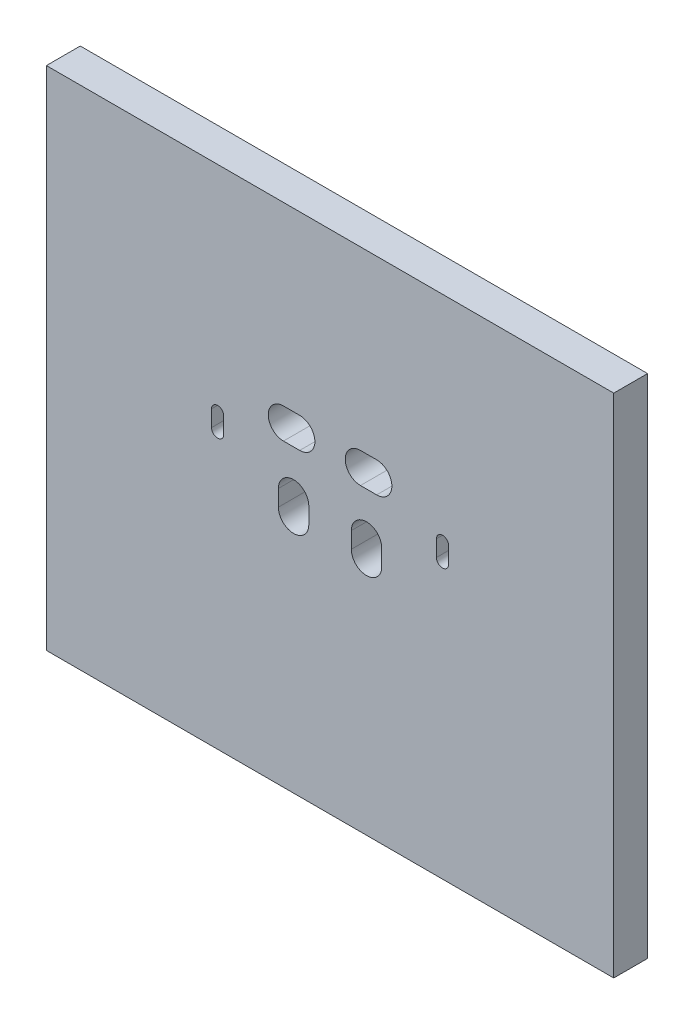
ISO-10303-21;
HEADER;
FILE_DESCRIPTION(('STEP AP214'),'2;1');
FILE_NAME('part.step','',(''),(''),'','','');
FILE_SCHEMA(('AUTOMOTIVE_DESIGN { 1 0 10303 214 1 1 1 1 }'));
ENDSEC;
DATA;
#1=APPLICATION_CONTEXT('core data for automotive mechanical design processes');
#2=APPLICATION_PROTOCOL_DEFINITION('international standard','automotive_design',2000,#1);
#3=PRODUCT_CONTEXT('',#1,'mechanical');
#4=PRODUCT('Part','Part','',(#3));
#5=PRODUCT_RELATED_PRODUCT_CATEGORY('part','',(#4));
#6=PRODUCT_DEFINITION_FORMATION('','',#4);
#7=PRODUCT_DEFINITION_CONTEXT('part definition',#1,'design');
#8=PRODUCT_DEFINITION('design','',#6,#7);
#9=PRODUCT_DEFINITION_SHAPE('','',#8);
#10=(LENGTH_UNIT() NAMED_UNIT(*) SI_UNIT(.MILLI.,.METRE.));
#11=(NAMED_UNIT(*) PLANE_ANGLE_UNIT() SI_UNIT($,.RADIAN.));
#12=(NAMED_UNIT(*) SI_UNIT($,.STERADIAN.) SOLID_ANGLE_UNIT());
#13=UNCERTAINTY_MEASURE_WITH_UNIT(LENGTH_MEASURE(1.E-05),#10,'distance_accuracy_value','');
#14=(GEOMETRIC_REPRESENTATION_CONTEXT(3) GLOBAL_UNCERTAINTY_ASSIGNED_CONTEXT((#13)) GLOBAL_UNIT_ASSIGNED_CONTEXT((#10,
#11,#12)) REPRESENTATION_CONTEXT('',''));
#15=CARTESIAN_POINT('',(0.,0.,0.));
#16=DIRECTION('',(0.,0.,1.));
#17=DIRECTION('',(1.,0.,0.));
#18=AXIS2_PLACEMENT_3D('',#15,#16,#17);
#19=CARTESIAN_POINT('',(8.45000088,14.39999914,0.));
#20=DIRECTION('',(0.,0.,-1.));
#21=DIRECTION('',(-1.,0.,0.));
#22=AXIS2_PLACEMENT_3D('',#19,#20,#21);
#23=CYLINDRICAL_SURFACE('',#22,0.2999994);
#24=CARTESIAN_POINT('',(8.45000088,14.39999914,1.67111934));
#25=DIRECTION('',(0.,0.,-1.));
#26=DIRECTION('',(-1.,0.,0.));
#27=AXIS2_PLACEMENT_3D('',#24,#25,#26);
#28=CIRCLE('',#27,0.2999994);
#29=CARTESIAN_POINT('',(8.15000148,14.39999914,1.67111934));
#30=VERTEX_POINT('',#29);
#31=CARTESIAN_POINT('',(8.75000028,14.39999914,1.67111934));
#32=VERTEX_POINT('',#31);
#33=EDGE_CURVE('E190',#30,#32,#28,.T.);
#34=ORIENTED_EDGE('',*,*,#33,.F.);
#35=DIRECTION('',(0.,0.,-1.));
#36=VECTOR('',#35,1.);
#37=CARTESIAN_POINT('',(8.15000148,14.39999914,0.));
#38=LINE('',#37,#36);
#39=CARTESIAN_POINT('',(8.15000148,14.39999914,0.));
#40=VERTEX_POINT('',#39);
#41=EDGE_CURVE('E192',#40,#30,#38,.F.);
#42=ORIENTED_EDGE('',*,*,#41,.F.);
#43=CARTESIAN_POINT('',(8.45000088,14.39999914,0.));
#44=DIRECTION('',(0.,0.,-1.));
#45=DIRECTION('',(-1.,0.,0.));
#46=AXIS2_PLACEMENT_3D('',#43,#44,#45);
#47=CIRCLE('',#46,0.2999994);
#48=CARTESIAN_POINT('',(8.75000028,14.39999914,0.));
#49=VERTEX_POINT('',#48);
#50=EDGE_CURVE('E19',#49,#40,#47,.F.);
#51=ORIENTED_EDGE('',*,*,#50,.F.);
#52=DIRECTION('',(0.,0.,1.));
#53=VECTOR('',#52,1.);
#54=CARTESIAN_POINT('',(8.75000028,14.39999914,0.));
#55=LINE('',#54,#53);
#56=EDGE_CURVE('E207',#32,#49,#55,.F.);
#57=ORIENTED_EDGE('',*,*,#56,.F.);
#58=EDGE_LOOP('',(#34,#42,#51,#57));
#59=FACE_BOUND('',#58,.T.);
#60=ADVANCED_FACE('F16',(#59),#23,.F.);
#61=CARTESIAN_POINT('',(19.549999,14.39999914,0.));
#62=DIRECTION('',(0.,0.,-1.));
#63=DIRECTION('',(-1.,0.,0.));
#64=AXIS2_PLACEMENT_3D('',#61,#62,#63);
#65=CYLINDRICAL_SURFACE('',#64,0.2999994);
#66=CARTESIAN_POINT('',(19.549999,14.39999914,1.67111934));
#67=DIRECTION('',(0.,0.,-1.));
#68=DIRECTION('',(-1.,0.,0.));
#69=AXIS2_PLACEMENT_3D('',#66,#67,#68);
#70=CIRCLE('',#69,0.2999994);
#71=CARTESIAN_POINT('',(19.8499984,14.39999914,1.67111934));
#72=VERTEX_POINT('',#71);
#73=CARTESIAN_POINT('',(19.2499996,14.39999914,1.67111934));
#74=VERTEX_POINT('',#73);
#75=EDGE_CURVE('E217',#72,#74,#70,.F.);
#76=ORIENTED_EDGE('',*,*,#75,.T.);
#77=DIRECTION('',(0.,0.,-1.));
#78=VECTOR('',#77,1.);
#79=CARTESIAN_POINT('',(19.2499996,14.39999914,0.));
#80=LINE('',#79,#78);
#81=CARTESIAN_POINT('',(19.2499996,14.39999914,0.));
#82=VERTEX_POINT('',#81);
#83=EDGE_CURVE('E213',#82,#74,#80,.F.);
#84=ORIENTED_EDGE('',*,*,#83,.F.);
#85=CARTESIAN_POINT('',(19.549999,14.39999914,0.));
#86=DIRECTION('',(0.,0.,-1.));
#87=DIRECTION('',(-1.,0.,0.));
#88=AXIS2_PLACEMENT_3D('',#85,#86,#87);
#89=CIRCLE('',#88,0.2999994);
#90=CARTESIAN_POINT('',(19.8499984,14.39999914,0.));
#91=VERTEX_POINT('',#90);
#92=EDGE_CURVE('E212',#91,#82,#89,.F.);
#93=ORIENTED_EDGE('',*,*,#92,.F.);
#94=DIRECTION('',(0.,0.,1.));
#95=VECTOR('',#94,1.);
#96=CARTESIAN_POINT('',(19.8499984,14.39999914,0.));
#97=LINE('',#96,#95);
#98=EDGE_CURVE('E218',#72,#91,#97,.F.);
#99=ORIENTED_EDGE('',*,*,#98,.F.);
#100=EDGE_LOOP('',(#76,#84,#93,#99));
#101=FACE_BOUND('',#100,.T.);
#102=ADVANCED_FACE('F524',(#101),#65,.F.);
#103=CARTESIAN_POINT('',(12.9499995,11.84999916,0.));
#104=DIRECTION('',(-1.,0.,0.));
#105=DIRECTION('',(0.,0.,1.));
#106=AXIS2_PLACEMENT_3D('',#103,#104,#105);
#107=PLANE('',#106);
#108=DIRECTION('',(0.,0.,-1.));
#109=VECTOR('',#108,1.);
#110=CARTESIAN_POINT('',(12.9499995,12.65000264,0.));
#111=LINE('',#110,#109);
#112=CARTESIAN_POINT('',(12.9499995,12.65000264,1.67111934));
#113=VERTEX_POINT('',#112);
#114=CARTESIAN_POINT('',(12.9499995,12.65000264,0.));
#115=VERTEX_POINT('',#114);
#116=EDGE_CURVE('E296',#113,#115,#111,.T.);
#117=ORIENTED_EDGE('',*,*,#116,.T.);
#118=DIRECTION('',(0.,1.,0.));
#119=VECTOR('',#118,1.);
#120=CARTESIAN_POINT('',(12.9499995,11.84999916,0.));
#121=LINE('',#120,#119);
#122=CARTESIAN_POINT('',(12.9499995,11.84999916,0.));
#123=VERTEX_POINT('',#122);
#124=EDGE_CURVE('E210',#115,#123,#121,.F.);
#125=ORIENTED_EDGE('',*,*,#124,.T.);
#126=DIRECTION('',(0.,0.,-1.));
#127=VECTOR('',#126,1.);
#128=CARTESIAN_POINT('',(12.9499995,11.84999916,0.));
#129=LINE('',#128,#127);
#130=CARTESIAN_POINT('',(12.9499995,11.84999916,1.67111934));
#131=VERTEX_POINT('',#130);
#132=EDGE_CURVE('E292',#123,#131,#129,.F.);
#133=ORIENTED_EDGE('',*,*,#132,.T.);
#134=DIRECTION('',(0.,1.,0.));
#135=VECTOR('',#134,1.);
#136=CARTESIAN_POINT('',(12.9499995,0.,1.67111934));
#137=LINE('',#136,#135);
#138=EDGE_CURVE('E315',#131,#113,#137,.T.);
#139=ORIENTED_EDGE('',*,*,#138,.T.);
#140=EDGE_LOOP('',(#117,#125,#133,#139));
#141=FACE_BOUND('',#140,.T.);
#142=ADVANCED_FACE('F522',(#141),#107,.T.);
#143=CARTESIAN_POINT('',(11.4500025,12.65000264,0.));
#144=DIRECTION('',(1.,0.,0.));
#145=DIRECTION('',(0.,0.,-1.));
#146=AXIS2_PLACEMENT_3D('',#143,#144,#145);
#147=PLANE('',#146);
#148=DIRECTION('',(0.,0.,-1.));
#149=VECTOR('',#148,1.);
#150=CARTESIAN_POINT('',(11.4500025,11.84999916,0.));
#151=LINE('',#150,#149);
#152=CARTESIAN_POINT('',(11.4500025,11.84999916,1.67111934));
#153=VERTEX_POINT('',#152);
#154=CARTESIAN_POINT('',(11.4500025,11.84999916,0.));
#155=VERTEX_POINT('',#154);
#156=EDGE_CURVE('E291',#153,#155,#151,.T.);
#157=ORIENTED_EDGE('',*,*,#156,.T.);
#158=DIRECTION('',(0.,1.,0.));
#159=VECTOR('',#158,1.);
#160=CARTESIAN_POINT('',(11.4500025,12.65000264,0.));
#161=LINE('',#160,#159);
#162=CARTESIAN_POINT('',(11.4500025,12.65000264,0.));
#163=VERTEX_POINT('',#162);
#164=EDGE_CURVE('E208',#155,#163,#161,.T.);
#165=ORIENTED_EDGE('',*,*,#164,.T.);
#166=DIRECTION('',(0.,0.,-1.));
#167=VECTOR('',#166,1.);
#168=CARTESIAN_POINT('',(11.4500025,12.65000264,0.));
#169=LINE('',#168,#167);
#170=CARTESIAN_POINT('',(11.4500025,12.65000264,1.67111934));
#171=VERTEX_POINT('',#170);
#172=EDGE_CURVE('E297',#163,#171,#169,.F.);
#173=ORIENTED_EDGE('',*,*,#172,.T.);
#174=DIRECTION('',(0.,1.,0.));
#175=VECTOR('',#174,1.);
#176=CARTESIAN_POINT('',(11.4500025,0.,1.67111934));
#177=LINE('',#176,#175);
#178=EDGE_CURVE('E311',#171,#153,#177,.F.);
#179=ORIENTED_EDGE('',*,*,#178,.T.);
#180=EDGE_LOOP('',(#157,#165,#173,#179));
#181=FACE_BOUND('',#180,.T.);
#182=ADVANCED_FACE('F518',(#181),#147,.T.);
#183=CARTESIAN_POINT('',(8.75000028,13.60000074,0.));
#184=DIRECTION('',(-1.,0.,0.));
#185=DIRECTION('',(0.,0.,1.));
#186=AXIS2_PLACEMENT_3D('',#183,#184,#185);
#187=PLANE('',#186);
#188=ORIENTED_EDGE('',*,*,#56,.T.);
#189=DIRECTION('',(0.,1.,0.));
#190=VECTOR('',#189,1.);
#191=CARTESIAN_POINT('',(8.75000028,13.60000074,0.));
#192=LINE('',#191,#190);
#193=CARTESIAN_POINT('',(8.75000028,13.60000074,0.));
#194=VERTEX_POINT('',#193);
#195=EDGE_CURVE('E188',#49,#194,#192,.F.);
#196=ORIENTED_EDGE('',*,*,#195,.T.);
#197=DIRECTION('',(0.,0.,-1.));
#198=VECTOR('',#197,1.);
#199=CARTESIAN_POINT('',(8.75000028,13.60000074,0.));
#200=LINE('',#199,#198);
#201=CARTESIAN_POINT('',(8.75000028,13.60000074,1.67111934));
#202=VERTEX_POINT('',#201);
#203=EDGE_CURVE('E287',#194,#202,#200,.F.);
#204=ORIENTED_EDGE('',*,*,#203,.T.);
#205=DIRECTION('',(0.,1.,0.));
#206=VECTOR('',#205,1.);
#207=CARTESIAN_POINT('',(8.75000028,0.,1.67111934));
#208=LINE('',#207,#206);
#209=EDGE_CURVE('E305',#202,#32,#208,.T.);
#210=ORIENTED_EDGE('',*,*,#209,.T.);
#211=EDGE_LOOP('',(#188,#196,#204,#210));
#212=FACE_BOUND('',#211,.T.);
#213=ADVANCED_FACE('F309',(#212),#187,.T.);
#214=CARTESIAN_POINT('',(8.15000148,14.39999914,0.));
#215=DIRECTION('',(1.,0.,0.));
#216=DIRECTION('',(0.,0.,-1.));
#217=AXIS2_PLACEMENT_3D('',#214,#215,#216);
#218=PLANE('',#217);
#219=DIRECTION('',(0.,0.,-1.));
#220=VECTOR('',#219,1.);
#221=CARTESIAN_POINT('',(8.15000148,13.60000074,0.));
#222=LINE('',#221,#220);
#223=CARTESIAN_POINT('',(8.15000148,13.60000074,1.67111934));
#224=VERTEX_POINT('',#223);
#225=CARTESIAN_POINT('',(8.15000148,13.60000074,0.));
#226=VERTEX_POINT('',#225);
#227=EDGE_CURVE('E198',#224,#226,#222,.T.);
#228=ORIENTED_EDGE('',*,*,#227,.T.);
#229=DIRECTION('',(0.,1.,0.));
#230=VECTOR('',#229,1.);
#231=CARTESIAN_POINT('',(8.15000148,14.39999914,0.));
#232=LINE('',#231,#230);
#233=EDGE_CURVE('E186',#226,#40,#232,.T.);
#234=ORIENTED_EDGE('',*,*,#233,.T.);
#235=ORIENTED_EDGE('',*,*,#41,.T.);
#236=DIRECTION('',(0.,1.,0.));
#237=VECTOR('',#236,1.);
#238=CARTESIAN_POINT('',(8.15000148,0.,1.67111934));
#239=LINE('',#238,#237);
#240=EDGE_CURVE('E307',#30,#224,#239,.F.);
#241=ORIENTED_EDGE('',*,*,#240,.T.);
#242=EDGE_LOOP('',(#228,#234,#235,#241));
#243=FACE_BOUND('',#242,.T.);
#244=ADVANCED_FACE('F196',(#243),#218,.T.);
#245=CARTESIAN_POINT('',(11.69999946,14.80000088,0.));
#246=DIRECTION('',(0.,1.,0.));
#247=DIRECTION('',(0.,0.,1.));
#248=AXIS2_PLACEMENT_3D('',#245,#246,#247);
#249=PLANE('',#248);
#250=DIRECTION('',(0.,0.,-1.));
#251=VECTOR('',#250,1.);
#252=CARTESIAN_POINT('',(12.50000294,14.80000088,0.));
#253=LINE('',#252,#251);
#254=CARTESIAN_POINT('',(12.50000294,14.80000088,1.67111934));
#255=VERTEX_POINT('',#254);
#256=CARTESIAN_POINT('',(12.50000294,14.80000088,0.));
#257=VERTEX_POINT('',#256);
#258=EDGE_CURVE('E282',#255,#257,#253,.T.);
#259=ORIENTED_EDGE('',*,*,#258,.T.);
#260=DIRECTION('',(1.,0.,0.));
#261=VECTOR('',#260,1.);
#262=CARTESIAN_POINT('',(11.69999946,14.80000088,0.));
#263=LINE('',#262,#261);
#264=CARTESIAN_POINT('',(11.69999946,14.80000088,0.));
#265=VERTEX_POINT('',#264);
#266=EDGE_CURVE('E200',#257,#265,#263,.F.);
#267=ORIENTED_EDGE('',*,*,#266,.T.);
#268=DIRECTION('',(0.,0.,-1.));
#269=VECTOR('',#268,1.);
#270=CARTESIAN_POINT('',(11.69999946,14.80000088,0.));
#271=LINE('',#270,#269);
#272=CARTESIAN_POINT('',(11.69999946,14.80000088,1.67111934));
#273=VERTEX_POINT('',#272);
#274=EDGE_CURVE('E278',#265,#273,#271,.F.);
#275=ORIENTED_EDGE('',*,*,#274,.T.);
#276=DIRECTION('',(-1.,0.,0.));
#277=VECTOR('',#276,1.);
#278=CARTESIAN_POINT('',(0.,14.80000088,1.67111934));
#279=LINE('',#278,#277);
#280=EDGE_CURVE('E313',#273,#255,#279,.F.);
#281=ORIENTED_EDGE('',*,*,#280,.T.);
#282=EDGE_LOOP('',(#259,#267,#275,#281));
#283=FACE_BOUND('',#282,.T.);
#284=ADVANCED_FACE('F344',(#283),#249,.T.);
#285=CARTESIAN_POINT('',(12.50000294,16.29999788,0.));
#286=DIRECTION('',(0.,-1.,0.));
#287=DIRECTION('',(0.,0.,-1.));
#288=AXIS2_PLACEMENT_3D('',#285,#286,#287);
#289=PLANE('',#288);
#290=DIRECTION('',(0.,0.,-1.));
#291=VECTOR('',#290,1.);
#292=CARTESIAN_POINT('',(11.69999946,16.29999788,0.));
#293=LINE('',#292,#291);
#294=CARTESIAN_POINT('',(11.69999946,16.29999788,1.67111934));
#295=VERTEX_POINT('',#294);
#296=CARTESIAN_POINT('',(11.69999946,16.29999788,0.));
#297=VERTEX_POINT('',#296);
#298=EDGE_CURVE('E277',#295,#297,#293,.T.);
#299=ORIENTED_EDGE('',*,*,#298,.T.);
#300=DIRECTION('',(1.,0.,0.));
#301=VECTOR('',#300,1.);
#302=CARTESIAN_POINT('',(12.50000294,16.29999788,0.));
#303=LINE('',#302,#301);
#304=CARTESIAN_POINT('',(12.50000294,16.29999788,0.));
#305=VERTEX_POINT('',#304);
#306=EDGE_CURVE('E202',#297,#305,#303,.T.);
#307=ORIENTED_EDGE('',*,*,#306,.T.);
#308=DIRECTION('',(0.,0.,-1.));
#309=VECTOR('',#308,1.);
#310=CARTESIAN_POINT('',(12.50000294,16.29999788,0.));
#311=LINE('',#310,#309);
#312=CARTESIAN_POINT('',(12.50000294,16.29999788,1.67111934));
#313=VERTEX_POINT('',#312);
#314=EDGE_CURVE('E283',#305,#313,#311,.F.);
#315=ORIENTED_EDGE('',*,*,#314,.T.);
#316=DIRECTION('',(-1.,0.,0.));
#317=VECTOR('',#316,1.);
#318=CARTESIAN_POINT('',(0.,16.29999788,1.67111934));
#319=LINE('',#318,#317);
#320=EDGE_CURVE('E395',#313,#295,#319,.T.);
#321=ORIENTED_EDGE('',*,*,#320,.T.);
#322=EDGE_LOOP('',(#299,#307,#315,#321));
#323=FACE_BOUND('',#322,.T.);
#324=ADVANCED_FACE('F330',(#323),#289,.T.);
#325=CARTESIAN_POINT('',(16.54999738,11.84999916,0.));
#326=DIRECTION('',(-1.,0.,0.));
#327=DIRECTION('',(0.,0.,1.));
#328=AXIS2_PLACEMENT_3D('',#325,#326,#327);
#329=PLANE('',#328);
#330=DIRECTION('',(0.,0.,-1.));
#331=VECTOR('',#330,1.);
#332=CARTESIAN_POINT('',(16.54999738,12.65000264,0.));
#333=LINE('',#332,#331);
#334=CARTESIAN_POINT('',(16.54999738,12.65000264,1.67111934));
#335=VERTEX_POINT('',#334);
#336=CARTESIAN_POINT('',(16.54999738,12.65000264,0.));
#337=VERTEX_POINT('',#336);
#338=EDGE_CURVE('E272',#335,#337,#333,.T.);
#339=ORIENTED_EDGE('',*,*,#338,.T.);
#340=DIRECTION('',(0.,1.,0.));
#341=VECTOR('',#340,1.);
#342=CARTESIAN_POINT('',(16.54999738,11.84999916,0.));
#343=LINE('',#342,#341);
#344=CARTESIAN_POINT('',(16.54999738,11.84999916,0.));
#345=VERTEX_POINT('',#344);
#346=EDGE_CURVE('E326',#337,#345,#343,.F.);
#347=ORIENTED_EDGE('',*,*,#346,.T.);
#348=DIRECTION('',(0.,0.,-1.));
#349=VECTOR('',#348,1.);
#350=CARTESIAN_POINT('',(16.54999738,11.84999916,0.));
#351=LINE('',#350,#349);
#352=CARTESIAN_POINT('',(16.54999738,11.84999916,1.67111934));
#353=VERTEX_POINT('',#352);
#354=EDGE_CURVE('E268',#345,#353,#351,.F.);
#355=ORIENTED_EDGE('',*,*,#354,.T.);
#356=DIRECTION('',(0.,1.,0.));
#357=VECTOR('',#356,1.);
#358=CARTESIAN_POINT('',(16.54999738,0.,1.67111934));
#359=LINE('',#358,#357);
#360=EDGE_CURVE('E393',#353,#335,#359,.T.);
#361=ORIENTED_EDGE('',*,*,#360,.T.);
#362=EDGE_LOOP('',(#339,#347,#355,#361));
#363=FACE_BOUND('',#362,.T.);
#364=ADVANCED_FACE('F541',(#363),#329,.T.);
#365=CARTESIAN_POINT('',(15.05000038,12.65000264,0.));
#366=DIRECTION('',(1.,0.,0.));
#367=DIRECTION('',(0.,0.,-1.));
#368=AXIS2_PLACEMENT_3D('',#365,#366,#367);
#369=PLANE('',#368);
#370=DIRECTION('',(0.,0.,-1.));
#371=VECTOR('',#370,1.);
#372=CARTESIAN_POINT('',(15.05000038,11.84999916,0.));
#373=LINE('',#372,#371);
#374=CARTESIAN_POINT('',(15.05000038,11.84999916,1.67111934));
#375=VERTEX_POINT('',#374);
#376=CARTESIAN_POINT('',(15.05000038,11.84999916,0.));
#377=VERTEX_POINT('',#376);
#378=EDGE_CURVE('E267',#375,#377,#373,.T.);
#379=ORIENTED_EDGE('',*,*,#378,.T.);
#380=DIRECTION('',(0.,1.,0.));
#381=VECTOR('',#380,1.);
#382=CARTESIAN_POINT('',(15.05000038,12.65000264,0.));
#383=LINE('',#382,#381);
#384=CARTESIAN_POINT('',(15.05000038,12.65000264,0.));
#385=VERTEX_POINT('',#384);
#386=EDGE_CURVE('E324',#377,#385,#383,.T.);
#387=ORIENTED_EDGE('',*,*,#386,.T.);
#388=DIRECTION('',(0.,0.,-1.));
#389=VECTOR('',#388,1.);
#390=CARTESIAN_POINT('',(15.05000038,12.65000264,0.));
#391=LINE('',#390,#389);
#392=CARTESIAN_POINT('',(15.05000038,12.65000264,1.67111934));
#393=VERTEX_POINT('',#392);
#394=EDGE_CURVE('E273',#385,#393,#391,.F.);
#395=ORIENTED_EDGE('',*,*,#394,.T.);
#396=DIRECTION('',(0.,1.,0.));
#397=VECTOR('',#396,1.);
#398=CARTESIAN_POINT('',(15.05000038,0.,1.67111934));
#399=LINE('',#398,#397);
#400=EDGE_CURVE('E391',#393,#375,#399,.F.);
#401=ORIENTED_EDGE('',*,*,#400,.T.);
#402=EDGE_LOOP('',(#379,#387,#395,#401));
#403=FACE_BOUND('',#402,.T.);
#404=ADVANCED_FACE('F544',(#403),#369,.T.);
#405=CARTESIAN_POINT('',(15.49999948,14.80000088,0.));
#406=DIRECTION('',(0.,1.,0.));
#407=DIRECTION('',(0.,0.,1.));
#408=AXIS2_PLACEMENT_3D('',#405,#406,#407);
#409=PLANE('',#408);
#410=DIRECTION('',(0.,0.,-1.));
#411=VECTOR('',#410,1.);
#412=CARTESIAN_POINT('',(16.30000296,14.80000088,0.));
#413=LINE('',#412,#411);
#414=CARTESIAN_POINT('',(16.30000296,14.80000088,1.67111934));
#415=VERTEX_POINT('',#414);
#416=CARTESIAN_POINT('',(16.30000296,14.80000088,0.));
#417=VERTEX_POINT('',#416);
#418=EDGE_CURVE('E262',#415,#417,#413,.T.);
#419=ORIENTED_EDGE('',*,*,#418,.T.);
#420=DIRECTION('',(1.,0.,0.));
#421=VECTOR('',#420,1.);
#422=CARTESIAN_POINT('',(15.49999948,14.80000088,0.));
#423=LINE('',#422,#421);
#424=CARTESIAN_POINT('',(15.49999948,14.80000088,0.));
#425=VERTEX_POINT('',#424);
#426=EDGE_CURVE('E322',#417,#425,#423,.F.);
#427=ORIENTED_EDGE('',*,*,#426,.T.);
#428=DIRECTION('',(0.,0.,-1.));
#429=VECTOR('',#428,1.);
#430=CARTESIAN_POINT('',(15.49999948,14.80000088,0.));
#431=LINE('',#430,#429);
#432=CARTESIAN_POINT('',(15.49999948,14.80000088,1.67111934));
#433=VERTEX_POINT('',#432);
#434=EDGE_CURVE('E258',#425,#433,#431,.F.);
#435=ORIENTED_EDGE('',*,*,#434,.T.);
#436=DIRECTION('',(-1.,0.,0.));
#437=VECTOR('',#436,1.);
#438=CARTESIAN_POINT('',(0.,14.80000088,1.67111934));
#439=LINE('',#438,#437);
#440=EDGE_CURVE('E389',#433,#415,#439,.F.);
#441=ORIENTED_EDGE('',*,*,#440,.T.);
#442=EDGE_LOOP('',(#419,#427,#435,#441));
#443=FACE_BOUND('',#442,.T.);
#444=ADVANCED_FACE('F548',(#443),#409,.T.);
#445=CARTESIAN_POINT('',(16.30000296,16.29999788,0.));
#446=DIRECTION('',(0.,-1.,0.));
#447=DIRECTION('',(0.,0.,-1.));
#448=AXIS2_PLACEMENT_3D('',#445,#446,#447);
#449=PLANE('',#448);
#450=DIRECTION('',(0.,0.,-1.));
#451=VECTOR('',#450,1.);
#452=CARTESIAN_POINT('',(15.49999948,16.29999788,0.));
#453=LINE('',#452,#451);
#454=CARTESIAN_POINT('',(15.49999948,16.29999788,1.67111934));
#455=VERTEX_POINT('',#454);
#456=CARTESIAN_POINT('',(15.49999948,16.29999788,0.));
#457=VERTEX_POINT('',#456);
#458=EDGE_CURVE('E257',#455,#457,#453,.T.);
#459=ORIENTED_EDGE('',*,*,#458,.T.);
#460=DIRECTION('',(1.,0.,0.));
#461=VECTOR('',#460,1.);
#462=CARTESIAN_POINT('',(16.30000296,16.29999788,0.));
#463=LINE('',#462,#461);
#464=CARTESIAN_POINT('',(16.30000296,16.29999788,0.));
#465=VERTEX_POINT('',#464);
#466=EDGE_CURVE('E221',#457,#465,#463,.T.);
#467=ORIENTED_EDGE('',*,*,#466,.T.);
#468=DIRECTION('',(0.,0.,-1.));
#469=VECTOR('',#468,1.);
#470=CARTESIAN_POINT('',(16.30000296,16.29999788,0.));
#471=LINE('',#470,#469);
#472=CARTESIAN_POINT('',(16.30000296,16.29999788,1.67111934));
#473=VERTEX_POINT('',#472);
#474=EDGE_CURVE('E263',#465,#473,#471,.F.);
#475=ORIENTED_EDGE('',*,*,#474,.T.);
#476=DIRECTION('',(-1.,0.,0.));
#477=VECTOR('',#476,1.);
#478=CARTESIAN_POINT('',(0.,16.29999788,1.67111934));
#479=LINE('',#478,#477);
#480=EDGE_CURVE('E387',#473,#455,#479,.T.);
#481=ORIENTED_EDGE('',*,*,#480,.T.);
#482=EDGE_LOOP('',(#459,#467,#475,#481));
#483=FACE_BOUND('',#482,.T.);
#484=ADVANCED_FACE('F552',(#483),#449,.T.);
#485=CARTESIAN_POINT('',(19.8499984,13.60000074,0.));
#486=DIRECTION('',(-1.,0.,0.));
#487=DIRECTION('',(0.,0.,1.));
#488=AXIS2_PLACEMENT_3D('',#485,#486,#487);
#489=PLANE('',#488);
#490=ORIENTED_EDGE('',*,*,#98,.T.);
#491=DIRECTION('',(0.,1.,0.));
#492=VECTOR('',#491,1.);
#493=CARTESIAN_POINT('',(19.8499984,13.60000074,0.));
#494=LINE('',#493,#492);
#495=CARTESIAN_POINT('',(19.8499984,13.60000074,0.));
#496=VERTEX_POINT('',#495);
#497=EDGE_CURVE('E220',#91,#496,#494,.F.);
#498=ORIENTED_EDGE('',*,*,#497,.T.);
#499=DIRECTION('',(0.,0.,-1.));
#500=VECTOR('',#499,1.);
#501=CARTESIAN_POINT('',(19.8499984,13.60000074,0.));
#502=LINE('',#501,#500);
#503=CARTESIAN_POINT('',(19.8499984,13.60000074,1.67111934));
#504=VERTEX_POINT('',#503);
#505=EDGE_CURVE('E253',#496,#504,#502,.F.);
#506=ORIENTED_EDGE('',*,*,#505,.T.);
#507=DIRECTION('',(0.,1.,0.));
#508=VECTOR('',#507,1.);
#509=CARTESIAN_POINT('',(19.8499984,0.,1.67111934));
#510=LINE('',#509,#508);
#511=EDGE_CURVE('E299',#504,#72,#510,.T.);
#512=ORIENTED_EDGE('',*,*,#511,.T.);
#513=EDGE_LOOP('',(#490,#498,#506,#512));
#514=FACE_BOUND('',#513,.T.);
#515=ADVANCED_FACE('F556',(#514),#489,.T.);
#516=CARTESIAN_POINT('',(0.,0.,1.67111934));
#517=DIRECTION('',(0.,0.,-1.));
#518=DIRECTION('',(-1.,0.,0.));
#519=AXIS2_PLACEMENT_3D('',#516,#517,#518);
#520=PLANE('',#519);
#521=DIRECTION('',(0.,1.,0.));
#522=VECTOR('',#521,1.);
#523=CARTESIAN_POINT('',(19.2499996,14.39999914,1.67111934));
#524=LINE('',#523,#522);
#525=CARTESIAN_POINT('',(19.2499996,13.60000074,1.67111934));
#526=VERTEX_POINT('',#525);
#527=EDGE_CURVE('E216',#74,#526,#524,.F.);
#528=ORIENTED_EDGE('',*,*,#527,.F.);
#529=ORIENTED_EDGE('',*,*,#75,.F.);
#530=ORIENTED_EDGE('',*,*,#511,.F.);
#531=CARTESIAN_POINT('',(19.549999,13.60000074,1.67111934));
#532=DIRECTION('',(0.,0.,-1.));
#533=DIRECTION('',(-1.,0.,0.));
#534=AXIS2_PLACEMENT_3D('',#531,#532,#533);
#535=CIRCLE('',#534,0.2999994);
#536=EDGE_CURVE('E250',#504,#526,#535,.T.);
#537=ORIENTED_EDGE('',*,*,#536,.T.);
#538=EDGE_LOOP('',(#528,#529,#530,#537));
#539=FACE_BOUND('',#538,.T.);
#540=ORIENTED_EDGE('',*,*,#480,.F.);
#541=CARTESIAN_POINT('',(16.30000296,15.54999938,1.67111934));
#542=DIRECTION('',(0.,0.,-1.));
#543=DIRECTION('',(-1.,0.,0.));
#544=AXIS2_PLACEMENT_3D('',#541,#542,#543);
#545=CIRCLE('',#544,0.7499985);
#546=EDGE_CURVE('E259',#473,#415,#545,.T.);
#547=ORIENTED_EDGE('',*,*,#546,.T.);
#548=ORIENTED_EDGE('',*,*,#440,.F.);
#549=CARTESIAN_POINT('',(15.49999948,15.54999938,1.67111934));
#550=DIRECTION('',(0.,0.,-1.));
#551=DIRECTION('',(-1.,0.,0.));
#552=AXIS2_PLACEMENT_3D('',#549,#550,#551);
#553=CIRCLE('',#552,0.7499985);
#554=EDGE_CURVE('E254',#433,#455,#553,.T.);
#555=ORIENTED_EDGE('',*,*,#554,.T.);
#556=EDGE_LOOP('',(#540,#547,#548,#555));
#557=FACE_BOUND('',#556,.T.);
#558=ORIENTED_EDGE('',*,*,#400,.F.);
#559=CARTESIAN_POINT('',(15.79999888,12.65000264,1.67111934));
#560=DIRECTION('',(0.,0.,-1.));
#561=DIRECTION('',(-1.,0.,0.));
#562=AXIS2_PLACEMENT_3D('',#559,#560,#561);
#563=CIRCLE('',#562,0.7499985);
#564=EDGE_CURVE('E269',#393,#335,#563,.T.);
#565=ORIENTED_EDGE('',*,*,#564,.T.);
#566=ORIENTED_EDGE('',*,*,#360,.F.);
#567=CARTESIAN_POINT('',(15.79999888,11.84999916,1.67111934));
#568=DIRECTION('',(0.,0.,-1.));
#569=DIRECTION('',(-1.,0.,0.));
#570=AXIS2_PLACEMENT_3D('',#567,#568,#569);
#571=CIRCLE('',#570,0.7499985);
#572=EDGE_CURVE('E264',#353,#375,#571,.T.);
#573=ORIENTED_EDGE('',*,*,#572,.T.);
#574=EDGE_LOOP('',(#558,#565,#566,#573));
#575=FACE_BOUND('',#574,.T.);
#576=ORIENTED_EDGE('',*,*,#320,.F.);
#577=CARTESIAN_POINT('',(12.50000294,15.54999938,1.67111934));
#578=DIRECTION('',(0.,0.,-1.));
#579=DIRECTION('',(-1.,0.,0.));
#580=AXIS2_PLACEMENT_3D('',#577,#578,#579);
#581=CIRCLE('',#580,0.7499985);
#582=EDGE_CURVE('E279',#313,#255,#581,.T.);
#583=ORIENTED_EDGE('',*,*,#582,.T.);
#584=ORIENTED_EDGE('',*,*,#280,.F.);
#585=CARTESIAN_POINT('',(11.69999946,15.54999938,1.67111934));
#586=DIRECTION('',(0.,0.,-1.));
#587=DIRECTION('',(-1.,0.,0.));
#588=AXIS2_PLACEMENT_3D('',#585,#586,#587);
#589=CIRCLE('',#588,0.7499985);
#590=EDGE_CURVE('E274',#273,#295,#589,.T.);
#591=ORIENTED_EDGE('',*,*,#590,.T.);
#592=EDGE_LOOP('',(#576,#583,#584,#591));
#593=FACE_BOUND('',#592,.T.);
#594=ORIENTED_EDGE('',*,*,#240,.F.);
#595=ORIENTED_EDGE('',*,*,#33,.T.);
#596=ORIENTED_EDGE('',*,*,#209,.F.);
#597=CARTESIAN_POINT('',(8.45000088,13.60000074,1.67111934));
#598=DIRECTION('',(0.,0.,-1.));
#599=DIRECTION('',(-1.,0.,0.));
#600=AXIS2_PLACEMENT_3D('',#597,#598,#599);
#601=CIRCLE('',#600,0.2999994);
#602=EDGE_CURVE('E284',#202,#224,#601,.T.);
#603=ORIENTED_EDGE('',*,*,#602,.T.);
#604=EDGE_LOOP('',(#594,#595,#596,#603));
#605=FACE_BOUND('',#604,.T.);
#606=ORIENTED_EDGE('',*,*,#178,.F.);
#607=CARTESIAN_POINT('',(12.200001,12.65000264,1.67111934));
#608=DIRECTION('',(0.,0.,-1.));
#609=DIRECTION('',(-1.,0.,0.));
#610=AXIS2_PLACEMENT_3D('',#607,#608,#609);
#611=CIRCLE('',#610,0.7499985);
#612=EDGE_CURVE('E293',#171,#113,#611,.T.);
#613=ORIENTED_EDGE('',*,*,#612,.T.);
#614=ORIENTED_EDGE('',*,*,#138,.F.);
#615=CARTESIAN_POINT('',(12.200001,11.84999916,1.67111934));
#616=DIRECTION('',(0.,0.,-1.));
#617=DIRECTION('',(-1.,0.,0.));
#618=AXIS2_PLACEMENT_3D('',#615,#616,#617);
#619=CIRCLE('',#618,0.7499985);
#620=EDGE_CURVE('E288',#131,#153,#619,.T.);
#621=ORIENTED_EDGE('',*,*,#620,.T.);
#622=EDGE_LOOP('',(#606,#613,#614,#621));
#623=FACE_BOUND('',#622,.T.);
#624=DIRECTION('',(0.,1.,0.));
#625=VECTOR('',#624,1.);
#626=CARTESIAN_POINT('',(27.99999988,0.,1.67111934));
#627=LINE('',#626,#625);
#628=CARTESIAN_POINT('',(27.99999988,0.,1.67111934));
#629=VERTEX_POINT('',#628);
#630=CARTESIAN_POINT('',(27.99999988,25.0000008,1.67111934));
#631=VERTEX_POINT('',#630);
#632=EDGE_CURVE('E370',#629,#631,#627,.T.);
#633=ORIENTED_EDGE('',*,*,#632,.T.);
#634=DIRECTION('',(1.,0.,0.));
#635=VECTOR('',#634,1.);
#636=CARTESIAN_POINT('',(27.99999988,25.0000008,1.67111934));
#637=LINE('',#636,#635);
#638=CARTESIAN_POINT('',(0.,25.0000008,1.67111934));
#639=VERTEX_POINT('',#638);
#640=EDGE_CURVE('E376',#631,#639,#637,.F.);
#641=ORIENTED_EDGE('',*,*,#640,.T.);
#642=DIRECTION('',(0.,1.,0.));
#643=VECTOR('',#642,1.);
#644=CARTESIAN_POINT('',(0.,25.0000008,1.67111934));
#645=LINE('',#644,#643);
#646=CARTESIAN_POINT('',(0.,0.,1.67111934));
#647=VERTEX_POINT('',#646);
#648=EDGE_CURVE('E379',#639,#647,#645,.F.);
#649=ORIENTED_EDGE('',*,*,#648,.T.);
#650=DIRECTION('',(1.,0.,0.));
#651=VECTOR('',#650,1.);
#652=CARTESIAN_POINT('',(0.,0.,1.67111934));
#653=LINE('',#652,#651);
#654=EDGE_CURVE('E361',#647,#629,#653,.T.);
#655=ORIENTED_EDGE('',*,*,#654,.T.);
#656=EDGE_LOOP('',(#633,#641,#649,#655));
#657=FACE_BOUND('',#656,.T.);
#658=ADVANCED_FACE('F302',(#539,#557,#575,#593,#605,#623,#657),#520,.F.);
#659=CARTESIAN_POINT('',(19.2499996,14.39999914,0.));
#660=DIRECTION('',(1.,0.,0.));
#661=DIRECTION('',(0.,0.,-1.));
#662=AXIS2_PLACEMENT_3D('',#659,#660,#661);
#663=PLANE('',#662);
#664=DIRECTION('',(0.,0.,-1.));
#665=VECTOR('',#664,1.);
#666=CARTESIAN_POINT('',(19.2499996,13.60000074,0.));
#667=LINE('',#666,#665);
#668=CARTESIAN_POINT('',(19.2499996,13.60000074,0.));
#669=VERTEX_POINT('',#668);
#670=EDGE_CURVE('E252',#526,#669,#667,.T.);
#671=ORIENTED_EDGE('',*,*,#670,.T.);
#672=DIRECTION('',(0.,1.,0.));
#673=VECTOR('',#672,1.);
#674=CARTESIAN_POINT('',(19.2499996,14.39999914,0.));
#675=LINE('',#674,#673);
#676=EDGE_CURVE('E33',#669,#82,#675,.T.);
#677=ORIENTED_EDGE('',*,*,#676,.T.);
#678=ORIENTED_EDGE('',*,*,#83,.T.);
#679=ORIENTED_EDGE('',*,*,#527,.T.);
#680=EDGE_LOOP('',(#671,#677,#678,#679));
#681=FACE_BOUND('',#680,.T.);
#682=ADVANCED_FACE('F563',(#681),#663,.T.);
#683=CARTESIAN_POINT('',(0.,25.0000008,0.));
#684=DIRECTION('',(1.,0.,0.));
#685=DIRECTION('',(0.,0.,-1.));
#686=AXIS2_PLACEMENT_3D('',#683,#684,#685);
#687=PLANE('',#686);
#688=DIRECTION('',(0.,0.,1.));
#689=VECTOR('',#688,1.);
#690=CARTESIAN_POINT('',(0.,0.,0.));
#691=LINE('',#690,#689);
#692=CARTESIAN_POINT('',(0.,0.,0.));
#693=VERTEX_POINT('',#692);
#694=EDGE_CURVE('E364',#693,#647,#691,.T.);
#695=ORIENTED_EDGE('',*,*,#694,.T.);
#696=ORIENTED_EDGE('',*,*,#648,.F.);
#697=DIRECTION('',(0.,0.,-1.));
#698=VECTOR('',#697,1.);
#699=CARTESIAN_POINT('',(0.,25.0000008,0.));
#700=LINE('',#699,#698);
#701=CARTESIAN_POINT('',(0.,25.0000008,0.));
#702=VERTEX_POINT('',#701);
#703=EDGE_CURVE('E373',#639,#702,#700,.T.);
#704=ORIENTED_EDGE('',*,*,#703,.T.);
#705=DIRECTION('',(0.,1.,0.));
#706=VECTOR('',#705,1.);
#707=CARTESIAN_POINT('',(0.,0.,0.));
#708=LINE('',#707,#706);
#709=EDGE_CURVE('E415',#693,#702,#708,.T.);
#710=ORIENTED_EDGE('',*,*,#709,.F.);
#711=EDGE_LOOP('',(#695,#696,#704,#710));
#712=FACE_BOUND('',#711,.T.);
#713=ADVANCED_FACE('F453',(#712),#687,.F.);
#714=CARTESIAN_POINT('',(27.99999988,25.0000008,0.));
#715=DIRECTION('',(0.,-1.,0.));
#716=DIRECTION('',(0.,0.,-1.));
#717=AXIS2_PLACEMENT_3D('',#714,#715,#716);
#718=PLANE('',#717);
#719=ORIENTED_EDGE('',*,*,#703,.F.);
#720=ORIENTED_EDGE('',*,*,#640,.F.);
#721=DIRECTION('',(0.,0.,1.));
#722=VECTOR('',#721,1.);
#723=CARTESIAN_POINT('',(27.99999988,25.0000008,0.));
#724=LINE('',#723,#722);
#725=CARTESIAN_POINT('',(27.99999988,25.0000008,0.));
#726=VERTEX_POINT('',#725);
#727=EDGE_CURVE('E367',#631,#726,#724,.F.);
#728=ORIENTED_EDGE('',*,*,#727,.T.);
#729=DIRECTION('',(-1.,0.,0.));
#730=VECTOR('',#729,1.);
#731=CARTESIAN_POINT('',(0.,25.0000008,0.));
#732=LINE('',#731,#730);
#733=EDGE_CURVE('E418',#702,#726,#732,.F.);
#734=ORIENTED_EDGE('',*,*,#733,.F.);
#735=EDGE_LOOP('',(#719,#720,#728,#734));
#736=FACE_BOUND('',#735,.T.);
#737=ADVANCED_FACE('F455',(#736),#718,.F.);
#738=CARTESIAN_POINT('',(27.99999988,0.,0.));
#739=DIRECTION('',(-1.,0.,0.));
#740=DIRECTION('',(0.,0.,1.));
#741=AXIS2_PLACEMENT_3D('',#738,#739,#740);
#742=PLANE('',#741);
#743=ORIENTED_EDGE('',*,*,#727,.F.);
#744=ORIENTED_EDGE('',*,*,#632,.F.);
#745=DIRECTION('',(0.,0.,1.));
#746=VECTOR('',#745,1.);
#747=CARTESIAN_POINT('',(27.99999988,0.,0.));
#748=LINE('',#747,#746);
#749=CARTESIAN_POINT('',(27.99999988,0.,0.));
#750=VERTEX_POINT('',#749);
#751=EDGE_CURVE('E358',#629,#750,#748,.F.);
#752=ORIENTED_EDGE('',*,*,#751,.T.);
#753=DIRECTION('',(0.,1.,0.));
#754=VECTOR('',#753,1.);
#755=CARTESIAN_POINT('',(27.99999988,0.,0.));
#756=LINE('',#755,#754);
#757=EDGE_CURVE('E421',#726,#750,#756,.F.);
#758=ORIENTED_EDGE('',*,*,#757,.F.);
#759=EDGE_LOOP('',(#743,#744,#752,#758));
#760=FACE_BOUND('',#759,.T.);
#761=ADVANCED_FACE('F456',(#760),#742,.F.);
#762=CARTESIAN_POINT('',(0.,0.,0.));
#763=DIRECTION('',(0.,1.,0.));
#764=DIRECTION('',(0.,0.,1.));
#765=AXIS2_PLACEMENT_3D('',#762,#763,#764);
#766=PLANE('',#765);
#767=ORIENTED_EDGE('',*,*,#751,.F.);
#768=ORIENTED_EDGE('',*,*,#654,.F.);
#769=ORIENTED_EDGE('',*,*,#694,.F.);
#770=DIRECTION('',(-1.,0.,0.));
#771=VECTOR('',#770,1.);
#772=CARTESIAN_POINT('',(0.,0.,0.));
#773=LINE('',#772,#771);
#774=EDGE_CURVE('E249',#750,#693,#773,.T.);
#775=ORIENTED_EDGE('',*,*,#774,.F.);
#776=EDGE_LOOP('',(#767,#768,#769,#775));
#777=FACE_BOUND('',#776,.T.);
#778=ADVANCED_FACE('F434',(#777),#766,.F.);
#779=CARTESIAN_POINT('',(12.200001,12.65000264,0.));
#780=DIRECTION('',(0.,0.,-1.));
#781=DIRECTION('',(-1.,0.,0.));
#782=AXIS2_PLACEMENT_3D('',#779,#780,#781);
#783=CYLINDRICAL_SURFACE('',#782,0.7499985);
#784=ORIENTED_EDGE('',*,*,#612,.F.);
#785=ORIENTED_EDGE('',*,*,#172,.F.);
#786=CARTESIAN_POINT('',(12.200001,12.65000264,0.));
#787=DIRECTION('',(0.,0.,-1.));
#788=DIRECTION('',(-1.,0.,0.));
#789=AXIS2_PLACEMENT_3D('',#786,#787,#788);
#790=CIRCLE('',#789,0.7499985);
#791=EDGE_CURVE('E246',#115,#163,#790,.F.);
#792=ORIENTED_EDGE('',*,*,#791,.F.);
#793=ORIENTED_EDGE('',*,*,#116,.F.);
#794=EDGE_LOOP('',(#784,#785,#792,#793));
#795=FACE_BOUND('',#794,.T.);
#796=ADVANCED_FACE('F464',(#795),#783,.F.);
#797=CARTESIAN_POINT('',(12.200001,11.84999916,0.));
#798=DIRECTION('',(0.,0.,-1.));
#799=DIRECTION('',(-1.,0.,0.));
#800=AXIS2_PLACEMENT_3D('',#797,#798,#799);
#801=CYLINDRICAL_SURFACE('',#800,0.7499985);
#802=ORIENTED_EDGE('',*,*,#620,.F.);
#803=ORIENTED_EDGE('',*,*,#132,.F.);
#804=CARTESIAN_POINT('',(12.200001,11.84999916,0.));
#805=DIRECTION('',(0.,0.,-1.));
#806=DIRECTION('',(-1.,0.,0.));
#807=AXIS2_PLACEMENT_3D('',#804,#805,#806);
#808=CIRCLE('',#807,0.7499985);
#809=EDGE_CURVE('E243',#155,#123,#808,.F.);
#810=ORIENTED_EDGE('',*,*,#809,.F.);
#811=ORIENTED_EDGE('',*,*,#156,.F.);
#812=EDGE_LOOP('',(#802,#803,#810,#811));
#813=FACE_BOUND('',#812,.T.);
#814=ADVANCED_FACE('F500',(#813),#801,.F.);
#815=CARTESIAN_POINT('',(8.45000088,13.60000074,0.));
#816=DIRECTION('',(0.,0.,-1.));
#817=DIRECTION('',(-1.,0.,0.));
#818=AXIS2_PLACEMENT_3D('',#815,#816,#817);
#819=CYLINDRICAL_SURFACE('',#818,0.2999994);
#820=ORIENTED_EDGE('',*,*,#602,.F.);
#821=ORIENTED_EDGE('',*,*,#203,.F.);
#822=CARTESIAN_POINT('',(8.45000088,13.60000074,0.));
#823=DIRECTION('',(0.,0.,-1.));
#824=DIRECTION('',(-1.,0.,0.));
#825=AXIS2_PLACEMENT_3D('',#822,#823,#824);
#826=CIRCLE('',#825,0.2999994);
#827=EDGE_CURVE('E241',#226,#194,#826,.F.);
#828=ORIENTED_EDGE('',*,*,#827,.F.);
#829=ORIENTED_EDGE('',*,*,#227,.F.);
#830=EDGE_LOOP('',(#820,#821,#828,#829));
#831=FACE_BOUND('',#830,.T.);
#832=ADVANCED_FACE('F497',(#831),#819,.F.);
#833=CARTESIAN_POINT('',(12.50000294,15.54999938,0.));
#834=DIRECTION('',(0.,0.,-1.));
#835=DIRECTION('',(-1.,0.,0.));
#836=AXIS2_PLACEMENT_3D('',#833,#834,#835);
#837=CYLINDRICAL_SURFACE('',#836,0.7499985);
#838=ORIENTED_EDGE('',*,*,#582,.F.);
#839=ORIENTED_EDGE('',*,*,#314,.F.);
#840=CARTESIAN_POINT('',(12.50000294,15.54999938,0.));
#841=DIRECTION('',(0.,0.,-1.));
#842=DIRECTION('',(-1.,0.,0.));
#843=AXIS2_PLACEMENT_3D('',#840,#841,#842);
#844=CIRCLE('',#843,0.7499985);
#845=EDGE_CURVE('E238',#257,#305,#844,.F.);
#846=ORIENTED_EDGE('',*,*,#845,.F.);
#847=ORIENTED_EDGE('',*,*,#258,.F.);
#848=EDGE_LOOP('',(#838,#839,#846,#847));
#849=FACE_BOUND('',#848,.T.);
#850=ADVANCED_FACE('F338',(#849),#837,.F.);
#851=CARTESIAN_POINT('',(11.69999946,15.54999938,0.));
#852=DIRECTION('',(0.,0.,-1.));
#853=DIRECTION('',(-1.,0.,0.));
#854=AXIS2_PLACEMENT_3D('',#851,#852,#853);
#855=CYLINDRICAL_SURFACE('',#854,0.7499985);
#856=ORIENTED_EDGE('',*,*,#590,.F.);
#857=ORIENTED_EDGE('',*,*,#274,.F.);
#858=CARTESIAN_POINT('',(11.69999946,15.54999938,0.));
#859=DIRECTION('',(0.,0.,-1.));
#860=DIRECTION('',(-1.,0.,0.));
#861=AXIS2_PLACEMENT_3D('',#858,#859,#860);
#862=CIRCLE('',#861,0.7499985);
#863=EDGE_CURVE('E235',#297,#265,#862,.F.);
#864=ORIENTED_EDGE('',*,*,#863,.F.);
#865=ORIENTED_EDGE('',*,*,#298,.F.);
#866=EDGE_LOOP('',(#856,#857,#864,#865));
#867=FACE_BOUND('',#866,.T.);
#868=ADVANCED_FACE('F399',(#867),#855,.F.);
#869=CARTESIAN_POINT('',(15.79999888,12.65000264,0.));
#870=DIRECTION('',(0.,0.,-1.));
#871=DIRECTION('',(-1.,0.,0.));
#872=AXIS2_PLACEMENT_3D('',#869,#870,#871);
#873=CYLINDRICAL_SURFACE('',#872,0.7499985);
#874=ORIENTED_EDGE('',*,*,#564,.F.);
#875=ORIENTED_EDGE('',*,*,#394,.F.);
#876=CARTESIAN_POINT('',(15.79999888,12.65000264,0.));
#877=DIRECTION('',(0.,0.,-1.));
#878=DIRECTION('',(-1.,0.,0.));
#879=AXIS2_PLACEMENT_3D('',#876,#877,#878);
#880=CIRCLE('',#879,0.7499985);
#881=EDGE_CURVE('E232',#337,#385,#880,.F.);
#882=ORIENTED_EDGE('',*,*,#881,.F.);
#883=ORIENTED_EDGE('',*,*,#338,.F.);
#884=EDGE_LOOP('',(#874,#875,#882,#883));
#885=FACE_BOUND('',#884,.T.);
#886=ADVANCED_FACE('F488',(#885),#873,.F.);
#887=CARTESIAN_POINT('',(15.79999888,11.84999916,0.));
#888=DIRECTION('',(0.,0.,-1.));
#889=DIRECTION('',(-1.,0.,0.));
#890=AXIS2_PLACEMENT_3D('',#887,#888,#889);
#891=CYLINDRICAL_SURFACE('',#890,0.7499985);
#892=ORIENTED_EDGE('',*,*,#572,.F.);
#893=ORIENTED_EDGE('',*,*,#354,.F.);
#894=CARTESIAN_POINT('',(15.79999888,11.84999916,0.));
#895=DIRECTION('',(0.,0.,-1.));
#896=DIRECTION('',(-1.,0.,0.));
#897=AXIS2_PLACEMENT_3D('',#894,#895,#896);
#898=CIRCLE('',#897,0.7499985);
#899=EDGE_CURVE('E229',#377,#345,#898,.F.);
#900=ORIENTED_EDGE('',*,*,#899,.F.);
#901=ORIENTED_EDGE('',*,*,#378,.F.);
#902=EDGE_LOOP('',(#892,#893,#900,#901));
#903=FACE_BOUND('',#902,.T.);
#904=ADVANCED_FACE('F484',(#903),#891,.F.);
#905=CARTESIAN_POINT('',(16.30000296,15.54999938,0.));
#906=DIRECTION('',(0.,0.,-1.));
#907=DIRECTION('',(-1.,0.,0.));
#908=AXIS2_PLACEMENT_3D('',#905,#906,#907);
#909=CYLINDRICAL_SURFACE('',#908,0.7499985);
#910=ORIENTED_EDGE('',*,*,#546,.F.);
#911=ORIENTED_EDGE('',*,*,#474,.F.);
#912=CARTESIAN_POINT('',(16.30000296,15.54999938,0.));
#913=DIRECTION('',(0.,0.,-1.));
#914=DIRECTION('',(-1.,0.,0.));
#915=AXIS2_PLACEMENT_3D('',#912,#913,#914);
#916=CIRCLE('',#915,0.7499985);
#917=EDGE_CURVE('E226',#417,#465,#916,.F.);
#918=ORIENTED_EDGE('',*,*,#917,.F.);
#919=ORIENTED_EDGE('',*,*,#418,.F.);
#920=EDGE_LOOP('',(#910,#911,#918,#919));
#921=FACE_BOUND('',#920,.T.);
#922=ADVANCED_FACE('F480',(#921),#909,.F.);
#923=CARTESIAN_POINT('',(15.49999948,15.54999938,0.));
#924=DIRECTION('',(0.,0.,-1.));
#925=DIRECTION('',(-1.,0.,0.));
#926=AXIS2_PLACEMENT_3D('',#923,#924,#925);
#927=CYLINDRICAL_SURFACE('',#926,0.7499985);
#928=ORIENTED_EDGE('',*,*,#554,.F.);
#929=ORIENTED_EDGE('',*,*,#434,.F.);
#930=CARTESIAN_POINT('',(15.49999948,15.54999938,0.));
#931=DIRECTION('',(0.,0.,-1.));
#932=DIRECTION('',(-1.,0.,0.));
#933=AXIS2_PLACEMENT_3D('',#930,#931,#932);
#934=CIRCLE('',#933,0.7499985);
#935=EDGE_CURVE('E25',#457,#425,#934,.F.);
#936=ORIENTED_EDGE('',*,*,#935,.F.);
#937=ORIENTED_EDGE('',*,*,#458,.F.);
#938=EDGE_LOOP('',(#928,#929,#936,#937));
#939=FACE_BOUND('',#938,.T.);
#940=ADVANCED_FACE('F473',(#939),#927,.F.);
#941=CARTESIAN_POINT('',(19.549999,13.60000074,0.));
#942=DIRECTION('',(0.,0.,-1.));
#943=DIRECTION('',(-1.,0.,0.));
#944=AXIS2_PLACEMENT_3D('',#941,#942,#943);
#945=CYLINDRICAL_SURFACE('',#944,0.2999994);
#946=ORIENTED_EDGE('',*,*,#536,.F.);
#947=ORIENTED_EDGE('',*,*,#505,.F.);
#948=CARTESIAN_POINT('',(19.549999,13.60000074,0.));
#949=DIRECTION('',(0.,0.,-1.));
#950=DIRECTION('',(-1.,0.,0.));
#951=AXIS2_PLACEMENT_3D('',#948,#949,#950);
#952=CIRCLE('',#951,0.2999994);
#953=EDGE_CURVE('E11',#669,#496,#952,.F.);
#954=ORIENTED_EDGE('',*,*,#953,.F.);
#955=ORIENTED_EDGE('',*,*,#670,.F.);
#956=EDGE_LOOP('',(#946,#947,#954,#955));
#957=FACE_BOUND('',#956,.T.);
#958=ADVANCED_FACE('F468',(#957),#945,.F.);
#959=CARTESIAN_POINT('',(0.,0.,0.));
#960=DIRECTION('',(0.,0.,-1.));
#961=DIRECTION('',(-1.,0.,0.));
#962=AXIS2_PLACEMENT_3D('',#959,#960,#961);
#963=PLANE('',#962);
#964=ORIENTED_EDGE('',*,*,#676,.F.);
#965=ORIENTED_EDGE('',*,*,#953,.T.);
#966=ORIENTED_EDGE('',*,*,#497,.F.);
#967=ORIENTED_EDGE('',*,*,#92,.T.);
#968=EDGE_LOOP('',(#964,#965,#966,#967));
#969=FACE_BOUND('',#968,.T.);
#970=ORIENTED_EDGE('',*,*,#466,.F.);
#971=ORIENTED_EDGE('',*,*,#935,.T.);
#972=ORIENTED_EDGE('',*,*,#426,.F.);
#973=ORIENTED_EDGE('',*,*,#917,.T.);
#974=EDGE_LOOP('',(#970,#971,#972,#973));
#975=FACE_BOUND('',#974,.T.);
#976=ORIENTED_EDGE('',*,*,#386,.F.);
#977=ORIENTED_EDGE('',*,*,#899,.T.);
#978=ORIENTED_EDGE('',*,*,#346,.F.);
#979=ORIENTED_EDGE('',*,*,#881,.T.);
#980=EDGE_LOOP('',(#976,#977,#978,#979));
#981=FACE_BOUND('',#980,.T.);
#982=ORIENTED_EDGE('',*,*,#306,.F.);
#983=ORIENTED_EDGE('',*,*,#863,.T.);
#984=ORIENTED_EDGE('',*,*,#266,.F.);
#985=ORIENTED_EDGE('',*,*,#845,.T.);
#986=EDGE_LOOP('',(#982,#983,#984,#985));
#987=FACE_BOUND('',#986,.T.);
#988=ORIENTED_EDGE('',*,*,#233,.F.);
#989=ORIENTED_EDGE('',*,*,#827,.T.);
#990=ORIENTED_EDGE('',*,*,#195,.F.);
#991=ORIENTED_EDGE('',*,*,#50,.T.);
#992=EDGE_LOOP('',(#988,#989,#990,#991));
#993=FACE_BOUND('',#992,.T.);
#994=ORIENTED_EDGE('',*,*,#164,.F.);
#995=ORIENTED_EDGE('',*,*,#809,.T.);
#996=ORIENTED_EDGE('',*,*,#124,.F.);
#997=ORIENTED_EDGE('',*,*,#791,.T.);
#998=EDGE_LOOP('',(#994,#995,#996,#997));
#999=FACE_BOUND('',#998,.T.);
#1000=ORIENTED_EDGE('',*,*,#757,.T.);
#1001=ORIENTED_EDGE('',*,*,#774,.T.);
#1002=ORIENTED_EDGE('',*,*,#709,.T.);
#1003=ORIENTED_EDGE('',*,*,#733,.T.);
#1004=EDGE_LOOP('',(#1000,#1001,#1002,#1003));
#1005=FACE_BOUND('',#1004,.T.);
#1006=ADVANCED_FACE('F182',(#969,#975,#981,#987,#993,#999,#1005),#963,.T.);
#1007=CLOSED_SHELL('',(#60,#102,#142,#182,#213,#244,#284,#324,#364,#404,#444,#484,#515,#658,
#682,#713,#737,#761,#778,#796,#814,#832,#850,#868,#886,#904,#922,#940,#958,#1006));
#1008=MANIFOLD_SOLID_BREP('B1',#1007);
#1009=ADVANCED_BREP_SHAPE_REPRESENTATION('',(#18,#1008),#14);
#1010=SHAPE_DEFINITION_REPRESENTATION(#9,#1009);
ENDSEC;
END-ISO-10303-21;
